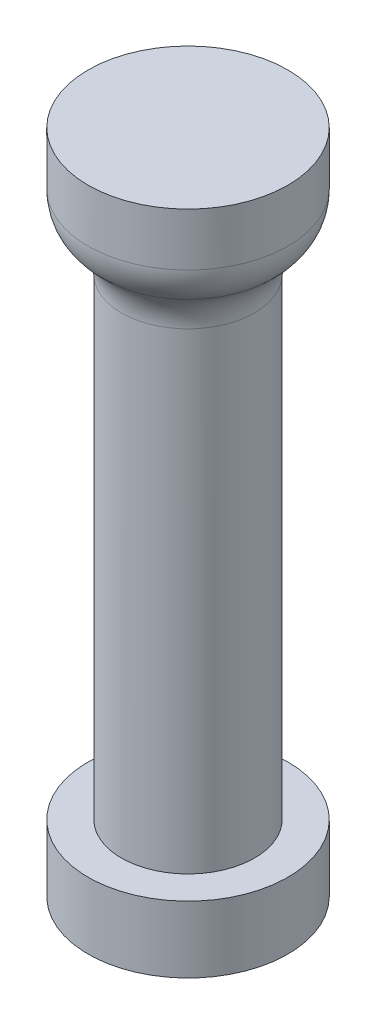
ISO-10303-21;
HEADER;
FILE_DESCRIPTION(('STEP AP214'),'2;1');
FILE_NAME('part.step','',(''),(''),'','','');
FILE_SCHEMA(('AUTOMOTIVE_DESIGN { 1 0 10303 214 1 1 1 1 }'));
ENDSEC;
DATA;
#1=APPLICATION_CONTEXT('core data for automotive mechanical design processes');
#2=APPLICATION_PROTOCOL_DEFINITION('international standard','automotive_design',2000,#1);
#3=PRODUCT_CONTEXT('',#1,'mechanical');
#4=PRODUCT('Part','Part','',(#3));
#5=PRODUCT_RELATED_PRODUCT_CATEGORY('part','',(#4));
#6=PRODUCT_DEFINITION_FORMATION('','',#4);
#7=PRODUCT_DEFINITION_CONTEXT('part definition',#1,'design');
#8=PRODUCT_DEFINITION('design','',#6,#7);
#9=PRODUCT_DEFINITION_SHAPE('','',#8);
#10=(LENGTH_UNIT() NAMED_UNIT(*) SI_UNIT(.MILLI.,.METRE.));
#11=(NAMED_UNIT(*) PLANE_ANGLE_UNIT() SI_UNIT($,.RADIAN.));
#12=(NAMED_UNIT(*) SI_UNIT($,.STERADIAN.) SOLID_ANGLE_UNIT());
#13=UNCERTAINTY_MEASURE_WITH_UNIT(LENGTH_MEASURE(1.E-05),#10,'distance_accuracy_value','');
#14=(GEOMETRIC_REPRESENTATION_CONTEXT(3) GLOBAL_UNCERTAINTY_ASSIGNED_CONTEXT((#13)) GLOBAL_UNIT_ASSIGNED_CONTEXT((#10,
#11,#12)) REPRESENTATION_CONTEXT('',''));
#15=CARTESIAN_POINT('',(0.,0.,0.));
#16=DIRECTION('',(0.,0.,1.));
#17=DIRECTION('',(1.,0.,0.));
#18=AXIS2_PLACEMENT_3D('',#15,#16,#17);
#19=CARTESIAN_POINT('',(0.,15.,0.));
#20=DIRECTION('',(0.,-1.,0.));
#21=DIRECTION('',(0.,0.,-1.));
#22=AXIS2_PLACEMENT_3D('',#19,#20,#21);
#23=CYLINDRICAL_SURFACE('',#22,2.);
#24=CARTESIAN_POINT('',(0.,14.1781455848733,0.));
#25=DIRECTION('',(0.,1.,0.));
#26=DIRECTION('',(0.,0.,1.));
#27=AXIS2_PLACEMENT_3D('',#24,#25,#26);
#28=CIRCLE('',#27,2.);
#29=CARTESIAN_POINT('',(0.,14.1781455848733,2.));
#30=VERTEX_POINT('',#29);
#31=EDGE_CURVE('E10',#30,#30,#28,.F.);
#32=ORIENTED_EDGE('',*,*,#31,.T.);
#33=EDGE_LOOP('',(#32));
#34=FACE_BOUND('',#33,.T.);
#35=CARTESIAN_POINT('',(0.,0.,0.));
#36=DIRECTION('',(0.,-1.,0.));
#37=DIRECTION('',(0.,0.,-1.));
#38=AXIS2_PLACEMENT_3D('',#35,#36,#37);
#39=CIRCLE('',#38,2.);
#40=CARTESIAN_POINT('',(0.,0.,-2.));
#41=VERTEX_POINT('',#40);
#42=EDGE_CURVE('E53',#41,#41,#39,.T.);
#43=ORIENTED_EDGE('',*,*,#42,.F.);
#44=EDGE_LOOP('',(#43));
#45=FACE_BOUND('',#44,.T.);
#46=ADVANCED_FACE('F33',(#34,#45),#23,.T.);
#47=CARTESIAN_POINT('',(0.,18.,0.));
#48=DIRECTION('',(0.,-1.,0.));
#49=DIRECTION('',(0.,0.,-1.));
#50=AXIS2_PLACEMENT_3D('',#47,#48,#49);
#51=CYLINDRICAL_SURFACE('',#50,3.);
#52=CARTESIAN_POINT('',(0.,16.4142135623731,0.));
#53=DIRECTION('',(0.,-1.,0.));
#54=DIRECTION('',(0.,0.,-1.));
#55=AXIS2_PLACEMENT_3D('',#52,#53,#54);
#56=CIRCLE('',#55,3.);
#57=CARTESIAN_POINT('',(0.,16.4142135623731,-3.));
#58=VERTEX_POINT('',#57);
#59=EDGE_CURVE('E44',#58,#58,#56,.F.);
#60=ORIENTED_EDGE('',*,*,#59,.T.);
#61=EDGE_LOOP('',(#60));
#62=FACE_BOUND('',#61,.T.);
#63=CARTESIAN_POINT('',(0.,18.,0.));
#64=DIRECTION('',(0.,1.,0.));
#65=DIRECTION('',(0.,0.,1.));
#66=AXIS2_PLACEMENT_3D('',#63,#64,#65);
#67=CIRCLE('',#66,3.);
#68=CARTESIAN_POINT('',(0.,18.,3.));
#69=VERTEX_POINT('',#68);
#70=EDGE_CURVE('E48',#69,#69,#67,.T.);
#71=ORIENTED_EDGE('',*,*,#70,.F.);
#72=EDGE_LOOP('',(#71));
#73=FACE_BOUND('',#72,.T.);
#74=ADVANCED_FACE('F80',(#62,#73),#51,.T.);
#75=CARTESIAN_POINT('',(0.,18.,0.));
#76=DIRECTION('',(0.,1.,0.));
#77=DIRECTION('',(0.,0.,1.));
#78=AXIS2_PLACEMENT_3D('',#75,#76,#77);
#79=PLANE('',#78);
#80=ORIENTED_EDGE('',*,*,#70,.T.);
#81=EDGE_LOOP('',(#80));
#82=FACE_BOUND('',#81,.T.);
#83=ADVANCED_FACE('F85',(#82),#79,.T.);
#84=CARTESIAN_POINT('',(0.,16.4142135623731,0.));
#85=DIRECTION('',(0.,-1.,0.));
#86=DIRECTION('',(0.,0.,-1.));
#87=AXIS2_PLACEMENT_3D('',#84,#85,#86);
#88=TOROIDAL_SURFACE('',#87,1.5,1.5);
#89=CARTESIAN_POINT('',(0.,15.2961795736232,0.));
#90=DIRECTION('',(0.,1.,0.));
#91=DIRECTION('',(0.,0.,1.));
#92=AXIS2_PLACEMENT_3D('',#89,#90,#91);
#93=CIRCLE('',#92,2.5);
#94=CARTESIAN_POINT('',(0.,15.2961795736232,2.5));
#95=VERTEX_POINT('',#94);
#96=EDGE_CURVE('E40',#95,#95,#93,.T.);
#97=ORIENTED_EDGE('',*,*,#96,.T.);
#98=EDGE_LOOP('',(#97));
#99=FACE_BOUND('',#98,.T.);
#100=ORIENTED_EDGE('',*,*,#59,.F.);
#101=EDGE_LOOP('',(#100));
#102=FACE_BOUND('',#101,.T.);
#103=ADVANCED_FACE('F90',(#99,#102),#88,.T.);
#104=CARTESIAN_POINT('',(0.,14.1781455848733,0.));
#105=DIRECTION('',(0.,1.,0.));
#106=DIRECTION('',(0.,0.,1.));
#107=AXIS2_PLACEMENT_3D('',#104,#105,#106);
#108=TOROIDAL_SURFACE('',#107,3.5,1.5);
#109=ORIENTED_EDGE('',*,*,#31,.F.);
#110=EDGE_LOOP('',(#109));
#111=FACE_BOUND('',#110,.T.);
#112=ORIENTED_EDGE('',*,*,#96,.F.);
#113=EDGE_LOOP('',(#112));
#114=FACE_BOUND('',#113,.T.);
#115=ADVANCED_FACE('F35',(#111,#114),#108,.F.);
#116=CARTESIAN_POINT('',(0.,-2.,0.));
#117=DIRECTION('',(0.,1.,0.));
#118=DIRECTION('',(0.,0.,1.));
#119=AXIS2_PLACEMENT_3D('',#116,#117,#118);
#120=CYLINDRICAL_SURFACE('',#119,3.);
#121=CARTESIAN_POINT('',(0.,-2.,0.));
#122=DIRECTION('',(0.,-1.,0.));
#123=DIRECTION('',(0.,0.,-1.));
#124=AXIS2_PLACEMENT_3D('',#121,#122,#123);
#125=CIRCLE('',#124,3.);
#126=CARTESIAN_POINT('',(0.,-2.,-3.));
#127=VERTEX_POINT('',#126);
#128=EDGE_CURVE('E56',#127,#127,#125,.T.);
#129=ORIENTED_EDGE('',*,*,#128,.F.);
#130=EDGE_LOOP('',(#129));
#131=FACE_BOUND('',#130,.T.);
#132=CARTESIAN_POINT('',(0.,0.,0.));
#133=DIRECTION('',(0.,-1.,0.));
#134=DIRECTION('',(0.,0.,-1.));
#135=AXIS2_PLACEMENT_3D('',#132,#133,#134);
#136=CIRCLE('',#135,3.);
#137=CARTESIAN_POINT('',(0.,0.,-3.));
#138=VERTEX_POINT('',#137);
#139=EDGE_CURVE('E57',#138,#138,#136,.T.);
#140=ORIENTED_EDGE('',*,*,#139,.T.);
#141=EDGE_LOOP('',(#140));
#142=FACE_BOUND('',#141,.T.);
#143=ADVANCED_FACE('F65',(#131,#142),#120,.T.);
#144=CARTESIAN_POINT('',(0.,-2.,0.));
#145=DIRECTION('',(0.,-1.,0.));
#146=DIRECTION('',(0.,0.,-1.));
#147=AXIS2_PLACEMENT_3D('',#144,#145,#146);
#148=PLANE('',#147);
#149=ORIENTED_EDGE('',*,*,#128,.T.);
#150=EDGE_LOOP('',(#149));
#151=FACE_BOUND('',#150,.T.);
#152=ADVANCED_FACE('F63',(#151),#148,.T.);
#153=CARTESIAN_POINT('',(0.,0.,0.));
#154=DIRECTION('',(0.,-1.,0.));
#155=DIRECTION('',(0.,0.,-1.));
#156=AXIS2_PLACEMENT_3D('',#153,#154,#155);
#157=PLANE('',#156);
#158=ORIENTED_EDGE('',*,*,#42,.T.);
#159=EDGE_LOOP('',(#158));
#160=FACE_BOUND('',#159,.T.);
#161=ORIENTED_EDGE('',*,*,#139,.F.);
#162=EDGE_LOOP('',(#161));
#163=FACE_BOUND('',#162,.T.);
#164=ADVANCED_FACE('F71',(#160,#163),#157,.F.);
#165=CLOSED_SHELL('',(#46,#74,#83,#103,#115,#143,#152,#164));
#166=MANIFOLD_SOLID_BREP('B2',#165);
#167=ADVANCED_BREP_SHAPE_REPRESENTATION('',(#18,#166),#14);
#168=SHAPE_DEFINITION_REPRESENTATION(#9,#167);
ENDSEC;
END-ISO-10303-21;
